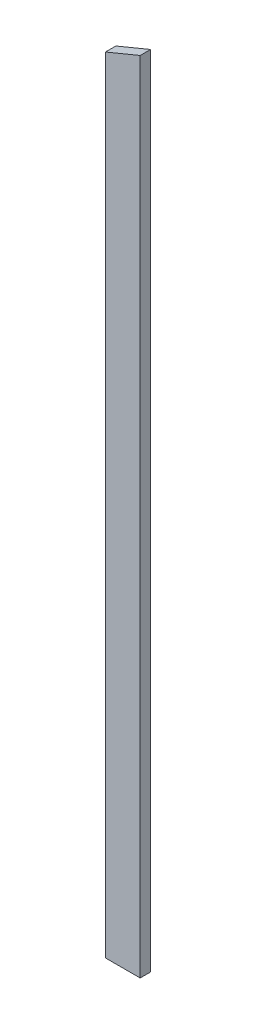
ISO-10303-21;
HEADER;
FILE_DESCRIPTION(('STEP AP214'),'2;1');
FILE_NAME('part.step','',(''),(''),'','','');
FILE_SCHEMA(('AUTOMOTIVE_DESIGN { 1 0 10303 214 1 1 1 1 }'));
ENDSEC;
DATA;
#1=APPLICATION_CONTEXT('core data for automotive mechanical design processes');
#2=APPLICATION_PROTOCOL_DEFINITION('international standard','automotive_design',2000,#1);
#3=PRODUCT_CONTEXT('',#1,'mechanical');
#4=PRODUCT('Part','Part','',(#3));
#5=PRODUCT_RELATED_PRODUCT_CATEGORY('part','',(#4));
#6=PRODUCT_DEFINITION_FORMATION('','',#4);
#7=PRODUCT_DEFINITION_CONTEXT('part definition',#1,'design');
#8=PRODUCT_DEFINITION('design','',#6,#7);
#9=PRODUCT_DEFINITION_SHAPE('','',#8);
#10=(LENGTH_UNIT() NAMED_UNIT(*) SI_UNIT(.MILLI.,.METRE.));
#11=(NAMED_UNIT(*) PLANE_ANGLE_UNIT() SI_UNIT($,.RADIAN.));
#12=(NAMED_UNIT(*) SI_UNIT($,.STERADIAN.) SOLID_ANGLE_UNIT());
#13=UNCERTAINTY_MEASURE_WITH_UNIT(LENGTH_MEASURE(1.E-05),#10,'distance_accuracy_value','');
#14=(GEOMETRIC_REPRESENTATION_CONTEXT(3) GLOBAL_UNCERTAINTY_ASSIGNED_CONTEXT((#13)) GLOBAL_UNIT_ASSIGNED_CONTEXT((#10,
#11,#12)) REPRESENTATION_CONTEXT('',''));
#15=CARTESIAN_POINT('',(0.,0.,0.));
#16=DIRECTION('',(0.,0.,1.));
#17=DIRECTION('',(1.,0.,0.));
#18=AXIS2_PLACEMENT_3D('',#15,#16,#17);
#19=CARTESIAN_POINT('',(-140.284498249528,1456.14550658058,19.05));
#20=DIRECTION('',(0.38268343236509,-0.923879532511287,0.));
#21=DIRECTION('',(0.923879532511287,0.38268343236509,0.));
#22=AXIS2_PLACEMENT_3D('',#19,#20,#21);
#23=PLANE('',#22);
#24=DIRECTION('',(-0.923879532511287,-0.38268343236509,0.));
#25=VECTOR('',#24,1.);
#26=CARTESIAN_POINT('',(-140.284498249528,1456.14550658058,0.));
#27=LINE('',#26,#25);
#28=CARTESIAN_POINT('',(-140.284498249528,1456.14550658058,0.));
#29=VERTEX_POINT('',#28);
#30=CARTESIAN_POINT('',(-203.784498249527,1429.84294536988,0.));
#31=VERTEX_POINT('',#30);
#32=EDGE_CURVE('E98',#29,#31,#27,.T.);
#33=ORIENTED_EDGE('',*,*,#32,.T.);
#34=DIRECTION('',(0.,0.,-1.));
#35=VECTOR('',#34,1.);
#36=CARTESIAN_POINT('',(-203.784498249527,1429.84294536988,19.05));
#37=LINE('',#36,#35);
#38=CARTESIAN_POINT('',(-203.784498249527,1429.84294536988,19.05));
#39=VERTEX_POINT('',#38);
#40=EDGE_CURVE('E11',#39,#31,#37,.T.);
#41=ORIENTED_EDGE('',*,*,#40,.F.);
#42=DIRECTION('',(-0.923879532511287,-0.38268343236509,0.));
#43=VECTOR('',#42,1.);
#44=CARTESIAN_POINT('',(-140.284498249528,1456.14550658058,19.05));
#45=LINE('',#44,#43);
#46=CARTESIAN_POINT('',(-140.284498249528,1456.14550658058,19.05));
#47=VERTEX_POINT('',#46);
#48=EDGE_CURVE('E86',#47,#39,#45,.T.);
#49=ORIENTED_EDGE('',*,*,#48,.F.);
#50=DIRECTION('',(0.,0.,-1.));
#51=VECTOR('',#50,1.);
#52=CARTESIAN_POINT('',(-140.284498249528,1456.14550658058,19.05));
#53=LINE('',#52,#51);
#54=EDGE_CURVE('E94',#47,#29,#53,.T.);
#55=ORIENTED_EDGE('',*,*,#54,.T.);
#56=EDGE_LOOP('',(#33,#41,#49,#55));
#57=FACE_BOUND('',#56,.T.);
#58=ADVANCED_FACE('F35',(#57),#23,.F.);
#59=CARTESIAN_POINT('',(-203.784498249528,-3.90321281407814,19.05));
#60=DIRECTION('',(1.,0.,0.));
#61=DIRECTION('',(0.,1.,0.));
#62=AXIS2_PLACEMENT_3D('',#59,#60,#61);
#63=PLANE('',#62);
#64=DIRECTION('',(0.,-1.,0.));
#65=VECTOR('',#64,1.);
#66=CARTESIAN_POINT('',(-203.784498249528,-3.90321281407814,0.));
#67=LINE('',#66,#65);
#68=CARTESIAN_POINT('',(-203.784498249528,-3.90321281407814,0.));
#69=VERTEX_POINT('',#68);
#70=EDGE_CURVE('E90',#31,#69,#67,.T.);
#71=ORIENTED_EDGE('',*,*,#70,.T.);
#72=DIRECTION('',(0.,0.,-1.));
#73=VECTOR('',#72,1.);
#74=CARTESIAN_POINT('',(-203.784498249528,-3.90321281407814,19.05));
#75=LINE('',#74,#73);
#76=CARTESIAN_POINT('',(-203.784498249528,-3.90321281407814,19.05));
#77=VERTEX_POINT('',#76);
#78=EDGE_CURVE('E43',#77,#69,#75,.T.);
#79=ORIENTED_EDGE('',*,*,#78,.F.);
#80=DIRECTION('',(0.,-1.,0.));
#81=VECTOR('',#80,1.);
#82=CARTESIAN_POINT('',(-203.784498249528,-3.90321281407814,19.05));
#83=LINE('',#82,#81);
#84=EDGE_CURVE('E81',#39,#77,#83,.T.);
#85=ORIENTED_EDGE('',*,*,#84,.F.);
#86=ORIENTED_EDGE('',*,*,#40,.T.);
#87=EDGE_LOOP('',(#71,#79,#85,#86));
#88=FACE_BOUND('',#87,.T.);
#89=ADVANCED_FACE('F89',(#88),#63,.F.);
#90=CARTESIAN_POINT('',(-140.284498249528,-3.90321281407813,19.05));
#91=DIRECTION('',(0.,1.,0.));
#92=DIRECTION('',(-1.,0.,0.));
#93=AXIS2_PLACEMENT_3D('',#90,#91,#92);
#94=PLANE('',#93);
#95=DIRECTION('',(1.,0.,0.));
#96=VECTOR('',#95,1.);
#97=CARTESIAN_POINT('',(-140.284498249528,-3.90321281407813,0.));
#98=LINE('',#97,#96);
#99=CARTESIAN_POINT('',(-140.284498249528,-3.90321281407813,0.));
#100=VERTEX_POINT('',#99);
#101=EDGE_CURVE('E68',#69,#100,#98,.T.);
#102=ORIENTED_EDGE('',*,*,#101,.T.);
#103=DIRECTION('',(0.,0.,-1.));
#104=VECTOR('',#103,1.);
#105=CARTESIAN_POINT('',(-140.284498249528,-3.90321281407813,19.05));
#106=LINE('',#105,#104);
#107=CARTESIAN_POINT('',(-140.284498249528,-3.90321281407813,19.05));
#108=VERTEX_POINT('',#107);
#109=EDGE_CURVE('E91',#108,#100,#106,.T.);
#110=ORIENTED_EDGE('',*,*,#109,.F.);
#111=DIRECTION('',(1.,0.,0.));
#112=VECTOR('',#111,1.);
#113=CARTESIAN_POINT('',(-140.284498249528,-3.90321281407813,19.05));
#114=LINE('',#113,#112);
#115=EDGE_CURVE('E84',#77,#108,#114,.T.);
#116=ORIENTED_EDGE('',*,*,#115,.F.);
#117=ORIENTED_EDGE('',*,*,#78,.T.);
#118=EDGE_LOOP('',(#102,#110,#116,#117));
#119=FACE_BOUND('',#118,.T.);
#120=ADVANCED_FACE('F92',(#119),#94,.F.);
#121=CARTESIAN_POINT('',(-140.284498249528,-3.90321281407813,19.05));
#122=DIRECTION('',(-1.,0.,0.));
#123=DIRECTION('',(0.,0.,1.));
#124=AXIS2_PLACEMENT_3D('',#121,#122,#123);
#125=PLANE('',#124);
#126=DIRECTION('',(0.,1.,0.));
#127=VECTOR('',#126,1.);
#128=CARTESIAN_POINT('',(-140.284498249528,-3.90321281407813,0.));
#129=LINE('',#128,#127);
#130=EDGE_CURVE('E74',#100,#29,#129,.T.);
#131=ORIENTED_EDGE('',*,*,#130,.T.);
#132=ORIENTED_EDGE('',*,*,#54,.F.);
#133=DIRECTION('',(0.,1.,0.));
#134=VECTOR('',#133,1.);
#135=CARTESIAN_POINT('',(-140.284498249528,-3.90321281407813,19.05));
#136=LINE('',#135,#134);
#137=EDGE_CURVE('E51',#108,#47,#136,.T.);
#138=ORIENTED_EDGE('',*,*,#137,.F.);
#139=ORIENTED_EDGE('',*,*,#109,.T.);
#140=EDGE_LOOP('',(#131,#132,#138,#139));
#141=FACE_BOUND('',#140,.T.);
#142=ADVANCED_FACE('F105',(#141),#125,.F.);
#143=CARTESIAN_POINT('',(0.,0.,19.05));
#144=DIRECTION('',(0.,0.,-1.));
#145=DIRECTION('',(-1.,0.,0.));
#146=AXIS2_PLACEMENT_3D('',#143,#144,#145);
#147=PLANE('',#146);
#148=ORIENTED_EDGE('',*,*,#48,.T.);
#149=ORIENTED_EDGE('',*,*,#84,.T.);
#150=ORIENTED_EDGE('',*,*,#115,.T.);
#151=ORIENTED_EDGE('',*,*,#137,.T.);
#152=EDGE_LOOP('',(#148,#149,#150,#151));
#153=FACE_BOUND('',#152,.T.);
#154=ADVANCED_FACE('F82',(#153),#147,.F.);
#155=CARTESIAN_POINT('',(0.,0.,0.));
#156=DIRECTION('',(0.,0.,-1.));
#157=DIRECTION('',(-1.,0.,0.));
#158=AXIS2_PLACEMENT_3D('',#155,#156,#157);
#159=PLANE('',#158);
#160=ORIENTED_EDGE('',*,*,#32,.F.);
#161=ORIENTED_EDGE('',*,*,#130,.F.);
#162=ORIENTED_EDGE('',*,*,#101,.F.);
#163=ORIENTED_EDGE('',*,*,#70,.F.);
#164=EDGE_LOOP('',(#160,#161,#162,#163));
#165=FACE_BOUND('',#164,.T.);
#166=ADVANCED_FACE('F108',(#165),#159,.T.);
#167=CLOSED_SHELL('',(#58,#89,#120,#142,#154,#166));
#168=MANIFOLD_SOLID_BREP('B2',#167);
#169=ADVANCED_BREP_SHAPE_REPRESENTATION('',(#18,#168),#14);
#170=SHAPE_DEFINITION_REPRESENTATION(#9,#169);
ENDSEC;
END-ISO-10303-21;
